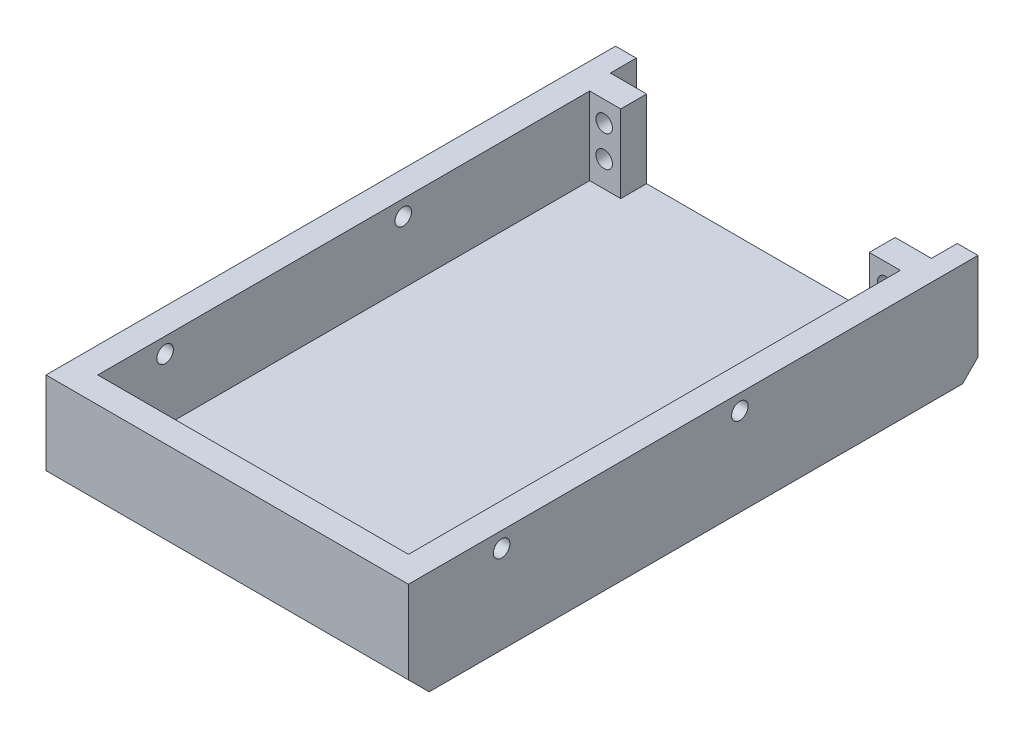
ISO-10303-21;
HEADER;
FILE_DESCRIPTION(('STEP AP214'),'2;1');
FILE_NAME('part.step','',(''),(''),'','','');
FILE_SCHEMA(('AUTOMOTIVE_DESIGN { 1 0 10303 214 1 1 1 1 }'));
ENDSEC;
DATA;
#1=APPLICATION_CONTEXT('core data for automotive mechanical design processes');
#2=APPLICATION_PROTOCOL_DEFINITION('international standard','automotive_design',2000,#1);
#3=PRODUCT_CONTEXT('',#1,'mechanical');
#4=PRODUCT('Part','Part','',(#3));
#5=PRODUCT_RELATED_PRODUCT_CATEGORY('part','',(#4));
#6=PRODUCT_DEFINITION_FORMATION('','',#4);
#7=PRODUCT_DEFINITION_CONTEXT('part definition',#1,'design');
#8=PRODUCT_DEFINITION('design','',#6,#7);
#9=PRODUCT_DEFINITION_SHAPE('','',#8);
#10=(LENGTH_UNIT() NAMED_UNIT(*) SI_UNIT(.MILLI.,.METRE.));
#11=(NAMED_UNIT(*) PLANE_ANGLE_UNIT() SI_UNIT($,.RADIAN.));
#12=(NAMED_UNIT(*) SI_UNIT($,.STERADIAN.) SOLID_ANGLE_UNIT());
#13=UNCERTAINTY_MEASURE_WITH_UNIT(LENGTH_MEASURE(1.E-05),#10,'distance_accuracy_value','');
#14=(GEOMETRIC_REPRESENTATION_CONTEXT(3) GLOBAL_UNCERTAINTY_ASSIGNED_CONTEXT((#13)) GLOBAL_UNIT_ASSIGNED_CONTEXT((#10,
#11,#12)) REPRESENTATION_CONTEXT('',''));
#15=CARTESIAN_POINT('',(0.,0.,0.));
#16=DIRECTION('',(0.,0.,1.));
#17=DIRECTION('',(1.,0.,0.));
#18=AXIS2_PLACEMENT_3D('',#15,#16,#17);
#19=CARTESIAN_POINT('',(-30.,20.,52.5));
#20=DIRECTION('',(1.,0.,0.));
#21=DIRECTION('',(0.,0.,-1.));
#22=AXIS2_PLACEMENT_3D('',#19,#20,#21);
#23=PLANE('',#22);
#24=CARTESIAN_POINT('',(-30.,17.,34.5));
#25=DIRECTION('',(1.,0.,0.));
#26=DIRECTION('',(0.,0.,-1.));
#27=AXIS2_PLACEMENT_3D('',#24,#25,#26);
#28=CIRCLE('',#27,1.6);
#29=CARTESIAN_POINT('',(-30.,17.,32.9));
#30=VERTEX_POINT('',#29);
#31=EDGE_CURVE('E295',#30,#30,#28,.T.);
#32=ORIENTED_EDGE('',*,*,#31,.F.);
#33=EDGE_LOOP('',(#32));
#34=FACE_BOUND('',#33,.T.);
#35=CARTESIAN_POINT('',(-30.,17.,-11.5));
#36=DIRECTION('',(1.,0.,0.));
#37=DIRECTION('',(0.,0.,-1.));
#38=AXIS2_PLACEMENT_3D('',#35,#36,#37);
#39=CIRCLE('',#38,1.6);
#40=CARTESIAN_POINT('',(-30.,17.,-13.1));
#41=VERTEX_POINT('',#40);
#42=EDGE_CURVE('E283',#41,#41,#39,.T.);
#43=ORIENTED_EDGE('',*,*,#42,.F.);
#44=EDGE_LOOP('',(#43));
#45=FACE_BOUND('',#44,.T.);
#46=DIRECTION('',(0.,0.,1.));
#47=VECTOR('',#46,1.);
#48=CARTESIAN_POINT('',(-30.,5.,0.));
#49=LINE('',#48,#47);
#50=CARTESIAN_POINT('',(-30.,5.,-47.5));
#51=VERTEX_POINT('',#50);
#52=CARTESIAN_POINT('',(-30.,5.,47.5));
#53=VERTEX_POINT('',#52);
#54=EDGE_CURVE('E302',#51,#53,#49,.T.);
#55=ORIENTED_EDGE('',*,*,#54,.F.);
#56=DIRECTION('',(0.,-1.,0.));
#57=VECTOR('',#56,1.);
#58=CARTESIAN_POINT('',(-30.,20.,-47.5));
#59=LINE('',#58,#57);
#60=CARTESIAN_POINT('',(-30.,20.,-47.5));
#61=VERTEX_POINT('',#60);
#62=EDGE_CURVE('E259',#61,#51,#59,.T.);
#63=ORIENTED_EDGE('',*,*,#62,.F.);
#64=DIRECTION('',(0.,0.,1.));
#65=VECTOR('',#64,1.);
#66=CARTESIAN_POINT('',(-30.,20.,0.));
#67=LINE('',#66,#65);
#68=CARTESIAN_POINT('',(-30.,20.,47.5));
#69=VERTEX_POINT('',#68);
#70=EDGE_CURVE('E316',#61,#69,#67,.T.);
#71=ORIENTED_EDGE('',*,*,#70,.T.);
#72=DIRECTION('',(0.,-1.,0.));
#73=VECTOR('',#72,1.);
#74=CARTESIAN_POINT('',(-30.,20.,47.5));
#75=LINE('',#74,#73);
#76=EDGE_CURVE('E306',#69,#53,#75,.T.);
#77=ORIENTED_EDGE('',*,*,#76,.T.);
#78=EDGE_LOOP('',(#55,#63,#71,#77));
#79=FACE_BOUND('',#78,.T.);
#80=ADVANCED_FACE('F41',(#34,#45,#79),#23,.T.);
#81=CARTESIAN_POINT('',(0.,5.,0.));
#82=DIRECTION('',(0.,-1.,0.));
#83=DIRECTION('',(0.,0.,-1.));
#84=AXIS2_PLACEMENT_3D('',#81,#82,#83);
#85=PLANE('',#84);
#86=DIRECTION('',(0.,0.,-1.));
#87=VECTOR('',#86,1.);
#88=CARTESIAN_POINT('',(30.,5.,0.));
#89=LINE('',#88,#87);
#90=CARTESIAN_POINT('',(30.,5.,47.5));
#91=VERTEX_POINT('',#90);
#92=CARTESIAN_POINT('',(30.,5.,-47.5));
#93=VERTEX_POINT('',#92);
#94=EDGE_CURVE('E299',#91,#93,#89,.T.);
#95=ORIENTED_EDGE('',*,*,#94,.T.);
#96=DIRECTION('',(1.,0.,0.));
#97=VECTOR('',#96,1.);
#98=CARTESIAN_POINT('',(24.,5.,-47.5));
#99=LINE('',#98,#97);
#100=CARTESIAN_POINT('',(24.,5.,-47.5));
#101=VERTEX_POINT('',#100);
#102=EDGE_CURVE('E252',#101,#93,#99,.T.);
#103=ORIENTED_EDGE('',*,*,#102,.F.);
#104=DIRECTION('',(0.,0.,-1.));
#105=VECTOR('',#104,1.);
#106=CARTESIAN_POINT('',(24.,5.,-47.5));
#107=LINE('',#106,#105);
#108=CARTESIAN_POINT('',(24.,5.,-52.5));
#109=VERTEX_POINT('',#108);
#110=EDGE_CURVE('E250',#101,#109,#107,.T.);
#111=ORIENTED_EDGE('',*,*,#110,.T.);
#112=DIRECTION('',(-1.,0.,0.));
#113=VECTOR('',#112,1.);
#114=CARTESIAN_POINT('',(30.,5.,-52.5));
#115=LINE('',#114,#113);
#116=CARTESIAN_POINT('',(-24.,5.,-52.5));
#117=VERTEX_POINT('',#116);
#118=EDGE_CURVE('E277',#109,#117,#115,.T.);
#119=ORIENTED_EDGE('',*,*,#118,.T.);
#120=DIRECTION('',(0.,0.,-1.));
#121=VECTOR('',#120,1.);
#122=CARTESIAN_POINT('',(-24.,5.,-47.5));
#123=LINE('',#122,#121);
#124=CARTESIAN_POINT('',(-24.,5.,-47.5));
#125=VERTEX_POINT('',#124);
#126=EDGE_CURVE('E263',#125,#117,#123,.T.);
#127=ORIENTED_EDGE('',*,*,#126,.F.);
#128=DIRECTION('',(-1.,0.,0.));
#129=VECTOR('',#128,1.);
#130=CARTESIAN_POINT('',(-24.,5.,-47.5));
#131=LINE('',#130,#129);
#132=EDGE_CURVE('E274',#125,#51,#131,.T.);
#133=ORIENTED_EDGE('',*,*,#132,.T.);
#134=ORIENTED_EDGE('',*,*,#54,.T.);
#135=DIRECTION('',(1.,0.,0.));
#136=VECTOR('',#135,1.);
#137=CARTESIAN_POINT('',(0.,5.,47.5));
#138=LINE('',#137,#136);
#139=EDGE_CURVE('E309',#53,#91,#138,.T.);
#140=ORIENTED_EDGE('',*,*,#139,.T.);
#141=EDGE_LOOP('',(#95,#103,#111,#119,#127,#133,#134,#140));
#142=FACE_BOUND('',#141,.T.);
#143=ADVANCED_FACE('F384',(#142),#85,.F.);
#144=CARTESIAN_POINT('',(0.,20.,0.));
#145=DIRECTION('',(0.,-1.,0.));
#146=DIRECTION('',(0.,0.,-1.));
#147=AXIS2_PLACEMENT_3D('',#144,#145,#146);
#148=PLANE('',#147);
#149=DIRECTION('',(0.,0.,-1.));
#150=VECTOR('',#149,1.);
#151=CARTESIAN_POINT('',(35.,20.,52.5));
#152=LINE('',#151,#150);
#153=CARTESIAN_POINT('',(35.,20.,52.5));
#154=VERTEX_POINT('',#153);
#155=CARTESIAN_POINT('',(35.,20.,-57.5));
#156=VERTEX_POINT('',#155);
#157=EDGE_CURVE('E319',#154,#156,#152,.T.);
#158=ORIENTED_EDGE('',*,*,#157,.T.);
#159=DIRECTION('',(1.,0.,0.));
#160=VECTOR('',#159,1.);
#161=CARTESIAN_POINT('',(35.,20.,-57.5));
#162=LINE('',#161,#160);
#163=CARTESIAN_POINT('',(31.,20.,-57.5));
#164=VERTEX_POINT('',#163);
#165=EDGE_CURVE('E205',#164,#156,#162,.T.);
#166=ORIENTED_EDGE('',*,*,#165,.F.);
#167=DIRECTION('',(0.,0.,-1.));
#168=VECTOR('',#167,1.);
#169=CARTESIAN_POINT('',(31.,20.,-57.5));
#170=LINE('',#169,#168);
#171=CARTESIAN_POINT('',(31.,20.,-52.5));
#172=VERTEX_POINT('',#171);
#173=EDGE_CURVE('E202',#172,#164,#170,.T.);
#174=ORIENTED_EDGE('',*,*,#173,.F.);
#175=DIRECTION('',(-1.,0.,0.));
#176=VECTOR('',#175,1.);
#177=CARTESIAN_POINT('',(-35.,20.,-52.5));
#178=LINE('',#177,#176);
#179=CARTESIAN_POINT('',(24.,20.,-52.5));
#180=VERTEX_POINT('',#179);
#181=EDGE_CURVE('E322',#172,#180,#178,.T.);
#182=ORIENTED_EDGE('',*,*,#181,.T.);
#183=DIRECTION('',(0.,0.,1.));
#184=VECTOR('',#183,1.);
#185=CARTESIAN_POINT('',(24.,20.,-47.5));
#186=LINE('',#185,#184);
#187=CARTESIAN_POINT('',(24.,20.,-47.5));
#188=VERTEX_POINT('',#187);
#189=EDGE_CURVE('E244',#180,#188,#186,.T.);
#190=ORIENTED_EDGE('',*,*,#189,.T.);
#191=DIRECTION('',(1.,0.,0.));
#192=VECTOR('',#191,1.);
#193=CARTESIAN_POINT('',(24.,20.,-47.5));
#194=LINE('',#193,#192);
#195=CARTESIAN_POINT('',(30.,20.,-47.5));
#196=VERTEX_POINT('',#195);
#197=EDGE_CURVE('E256',#188,#196,#194,.T.);
#198=ORIENTED_EDGE('',*,*,#197,.T.);
#199=DIRECTION('',(0.,0.,-1.));
#200=VECTOR('',#199,1.);
#201=CARTESIAN_POINT('',(30.,20.,0.));
#202=LINE('',#201,#200);
#203=CARTESIAN_POINT('',(30.,20.,47.5));
#204=VERTEX_POINT('',#203);
#205=EDGE_CURVE('E314',#204,#196,#202,.T.);
#206=ORIENTED_EDGE('',*,*,#205,.F.);
#207=DIRECTION('',(1.,0.,0.));
#208=VECTOR('',#207,1.);
#209=CARTESIAN_POINT('',(0.,20.,47.5));
#210=LINE('',#209,#208);
#211=EDGE_CURVE('E307',#69,#204,#210,.T.);
#212=ORIENTED_EDGE('',*,*,#211,.F.);
#213=ORIENTED_EDGE('',*,*,#70,.F.);
#214=DIRECTION('',(-1.,0.,0.));
#215=VECTOR('',#214,1.);
#216=CARTESIAN_POINT('',(-24.,20.,-47.5));
#217=LINE('',#216,#215);
#218=CARTESIAN_POINT('',(-24.,20.,-47.5));
#219=VERTEX_POINT('',#218);
#220=EDGE_CURVE('E271',#219,#61,#217,.T.);
#221=ORIENTED_EDGE('',*,*,#220,.F.);
#222=DIRECTION('',(0.,0.,1.));
#223=VECTOR('',#222,1.);
#224=CARTESIAN_POINT('',(-24.,20.,-47.5));
#225=LINE('',#224,#223);
#226=CARTESIAN_POINT('',(-24.,20.,-52.5));
#227=VERTEX_POINT('',#226);
#228=EDGE_CURVE('E269',#227,#219,#225,.T.);
#229=ORIENTED_EDGE('',*,*,#228,.F.);
#230=CARTESIAN_POINT('',(-31.,20.,-52.5));
#231=VERTEX_POINT('',#230);
#232=EDGE_CURVE('E180',#227,#231,#178,.T.);
#233=ORIENTED_EDGE('',*,*,#232,.T.);
#234=DIRECTION('',(0.,0.,-1.));
#235=VECTOR('',#234,1.);
#236=CARTESIAN_POINT('',(-31.,20.,-57.5));
#237=LINE('',#236,#235);
#238=CARTESIAN_POINT('',(-31.,20.,-57.5));
#239=VERTEX_POINT('',#238);
#240=EDGE_CURVE('E173',#231,#239,#237,.T.);
#241=ORIENTED_EDGE('',*,*,#240,.T.);
#242=DIRECTION('',(-1.,0.,0.));
#243=VECTOR('',#242,1.);
#244=CARTESIAN_POINT('',(-35.,20.,-57.5));
#245=LINE('',#244,#243);
#246=CARTESIAN_POINT('',(-35.,20.,-57.5));
#247=VERTEX_POINT('',#246);
#248=EDGE_CURVE('E177',#239,#247,#245,.T.);
#249=ORIENTED_EDGE('',*,*,#248,.T.);
#250=DIRECTION('',(0.,0.,1.));
#251=VECTOR('',#250,1.);
#252=CARTESIAN_POINT('',(-35.,20.,52.5));
#253=LINE('',#252,#251);
#254=CARTESIAN_POINT('',(-35.,20.,52.5));
#255=VERTEX_POINT('',#254);
#256=EDGE_CURVE('E324',#247,#255,#253,.T.);
#257=ORIENTED_EDGE('',*,*,#256,.T.);
#258=DIRECTION('',(1.,0.,0.));
#259=VECTOR('',#258,1.);
#260=CARTESIAN_POINT('',(-35.,20.,52.5));
#261=LINE('',#260,#259);
#262=EDGE_CURVE('E326',#255,#154,#261,.T.);
#263=ORIENTED_EDGE('',*,*,#262,.T.);
#264=EDGE_LOOP('',(#158,#166,#174,#182,#190,#198,#206,#212,#213,#221,#229,#233,#241,#249,#257,#263));
#265=FACE_BOUND('',#264,.T.);
#266=ADVANCED_FACE('F175',(#265),#148,.F.);
#267=CARTESIAN_POINT('',(35.,20.,52.5));
#268=DIRECTION('',(-1.,0.,0.));
#269=DIRECTION('',(0.,0.,1.));
#270=AXIS2_PLACEMENT_3D('',#267,#268,#269);
#271=PLANE('',#270);
#272=CARTESIAN_POINT('',(35.,17.,34.5));
#273=DIRECTION('',(-1.,0.,0.));
#274=DIRECTION('',(0.,0.,1.));
#275=AXIS2_PLACEMENT_3D('',#272,#273,#274);
#276=CIRCLE('',#275,1.6);
#277=CARTESIAN_POINT('',(35.,17.,36.1));
#278=VERTEX_POINT('',#277);
#279=EDGE_CURVE('E280',#278,#278,#276,.T.);
#280=ORIENTED_EDGE('',*,*,#279,.T.);
#281=EDGE_LOOP('',(#280));
#282=FACE_BOUND('',#281,.T.);
#283=CARTESIAN_POINT('',(35.,17.,-11.5));
#284=DIRECTION('',(-1.,0.,0.));
#285=DIRECTION('',(0.,0.,1.));
#286=AXIS2_PLACEMENT_3D('',#283,#284,#285);
#287=CIRCLE('',#286,1.6);
#288=CARTESIAN_POINT('',(35.,17.,-9.9));
#289=VERTEX_POINT('',#288);
#290=EDGE_CURVE('E287',#289,#289,#287,.T.);
#291=ORIENTED_EDGE('',*,*,#290,.T.);
#292=EDGE_LOOP('',(#291));
#293=FACE_BOUND('',#292,.T.);
#294=DIRECTION('',(0.,-1.,0.));
#295=VECTOR('',#294,1.);
#296=CARTESIAN_POINT('',(35.,20.,52.5));
#297=LINE('',#296,#295);
#298=CARTESIAN_POINT('',(35.,3.99999999999999,52.5));
#299=VERTEX_POINT('',#298);
#300=EDGE_CURVE('E328',#154,#299,#297,.T.);
#301=ORIENTED_EDGE('',*,*,#300,.T.);
#302=DIRECTION('',(0.,-0.707106781186545,-0.70710678118655));
#303=VECTOR('',#302,1.);
#304=CARTESIAN_POINT('',(35.,3.99999999999999,52.5));
#305=LINE('',#304,#303);
#306=CARTESIAN_POINT('',(35.,0.,48.5));
#307=VERTEX_POINT('',#306);
#308=EDGE_CURVE('E64',#299,#307,#305,.T.);
#309=ORIENTED_EDGE('',*,*,#308,.T.);
#310=DIRECTION('',(0.,0.,-1.));
#311=VECTOR('',#310,1.);
#312=CARTESIAN_POINT('',(35.,0.,52.5));
#313=LINE('',#312,#311);
#314=CARTESIAN_POINT('',(35.,0.,-54.5));
#315=VERTEX_POINT('',#314);
#316=EDGE_CURVE('E312',#307,#315,#313,.T.);
#317=ORIENTED_EDGE('',*,*,#316,.T.);
#318=DIRECTION('',(0.,0.707106781186546,-0.707106781186549));
#319=VECTOR('',#318,1.);
#320=CARTESIAN_POINT('',(35.,2.99999999999998,-57.5));
#321=LINE('',#320,#319);
#322=CARTESIAN_POINT('',(35.,2.99999999999998,-57.5));
#323=VERTEX_POINT('',#322);
#324=EDGE_CURVE('E350',#315,#323,#321,.T.);
#325=ORIENTED_EDGE('',*,*,#324,.T.);
#326=DIRECTION('',(0.,-1.,0.));
#327=VECTOR('',#326,1.);
#328=CARTESIAN_POINT('',(35.,26.4031242374329,-57.5));
#329=LINE('',#328,#327);
#330=EDGE_CURVE('E206',#156,#323,#329,.T.);
#331=ORIENTED_EDGE('',*,*,#330,.F.);
#332=ORIENTED_EDGE('',*,*,#157,.F.);
#333=EDGE_LOOP('',(#301,#309,#317,#325,#331,#332));
#334=FACE_BOUND('',#333,.T.);
#335=ADVANCED_FACE('F372',(#282,#293,#334),#271,.F.);
#336=CARTESIAN_POINT('',(-35.,20.,-52.5));
#337=DIRECTION('',(0.,0.,1.));
#338=DIRECTION('',(1.,0.,0.));
#339=AXIS2_PLACEMENT_3D('',#336,#337,#338);
#340=PLANE('',#339);
#341=CARTESIAN_POINT('',(-27.2,16.,-52.5));
#342=DIRECTION('',(0.,0.,1.));
#343=DIRECTION('',(1.,0.,0.));
#344=AXIS2_PLACEMENT_3D('',#341,#342,#343);
#345=CIRCLE('',#344,1.6);
#346=CARTESIAN_POINT('',(-25.6,16.,-52.5));
#347=VERTEX_POINT('',#346);
#348=EDGE_CURVE('E221',#347,#347,#345,.T.);
#349=ORIENTED_EDGE('',*,*,#348,.T.);
#350=EDGE_LOOP('',(#349));
#351=FACE_BOUND('',#350,.T.);
#352=CARTESIAN_POINT('',(-27.2,10.,-52.5));
#353=DIRECTION('',(0.,0.,1.));
#354=DIRECTION('',(1.,0.,0.));
#355=AXIS2_PLACEMENT_3D('',#352,#353,#354);
#356=CIRCLE('',#355,1.6);
#357=CARTESIAN_POINT('',(-25.6,10.,-52.5));
#358=VERTEX_POINT('',#357);
#359=EDGE_CURVE('E208',#358,#358,#356,.T.);
#360=ORIENTED_EDGE('',*,*,#359,.T.);
#361=EDGE_LOOP('',(#360));
#362=FACE_BOUND('',#361,.T.);
#363=CARTESIAN_POINT('',(27.2,16.,-52.5));
#364=DIRECTION('',(0.,0.,-1.));
#365=DIRECTION('',(-1.,0.,0.));
#366=AXIS2_PLACEMENT_3D('',#363,#364,#365);
#367=CIRCLE('',#366,1.6);
#368=CARTESIAN_POINT('',(25.6,16.,-52.5));
#369=VERTEX_POINT('',#368);
#370=EDGE_CURVE('E229',#369,#369,#367,.T.);
#371=ORIENTED_EDGE('',*,*,#370,.F.);
#372=EDGE_LOOP('',(#371));
#373=FACE_BOUND('',#372,.T.);
#374=CARTESIAN_POINT('',(27.2,10.,-52.5));
#375=DIRECTION('',(0.,0.,-1.));
#376=DIRECTION('',(-1.,0.,0.));
#377=AXIS2_PLACEMENT_3D('',#374,#375,#376);
#378=CIRCLE('',#377,1.6);
#379=CARTESIAN_POINT('',(25.6,10.,-52.5));
#380=VERTEX_POINT('',#379);
#381=EDGE_CURVE('E236',#380,#380,#378,.T.);
#382=ORIENTED_EDGE('',*,*,#381,.F.);
#383=EDGE_LOOP('',(#382));
#384=FACE_BOUND('',#383,.T.);
#385=DIRECTION('',(-1.,0.,0.));
#386=VECTOR('',#385,1.);
#387=CARTESIAN_POINT('',(-35.,0.,-52.5));
#388=LINE('',#387,#386);
#389=CARTESIAN_POINT('',(31.,0.,-52.5));
#390=VERTEX_POINT('',#389);
#391=CARTESIAN_POINT('',(-31.,0.,-52.5));
#392=VERTEX_POINT('',#391);
#393=EDGE_CURVE('E330',#390,#392,#388,.T.);
#394=ORIENTED_EDGE('',*,*,#393,.T.);
#395=DIRECTION('',(0.,-1.,0.));
#396=VECTOR('',#395,1.);
#397=CARTESIAN_POINT('',(-31.,26.4031242374329,-52.5));
#398=LINE('',#397,#396);
#399=EDGE_CURVE('E183',#231,#392,#398,.T.);
#400=ORIENTED_EDGE('',*,*,#399,.F.);
#401=ORIENTED_EDGE('',*,*,#232,.F.);
#402=DIRECTION('',(0.,1.,0.));
#403=VECTOR('',#402,1.);
#404=CARTESIAN_POINT('',(-24.,20.,-52.5));
#405=LINE('',#404,#403);
#406=EDGE_CURVE('E266',#117,#227,#405,.T.);
#407=ORIENTED_EDGE('',*,*,#406,.F.);
#408=ORIENTED_EDGE('',*,*,#118,.F.);
#409=DIRECTION('',(0.,1.,0.));
#410=VECTOR('',#409,1.);
#411=CARTESIAN_POINT('',(24.,20.,-52.5));
#412=LINE('',#411,#410);
#413=EDGE_CURVE('E247',#109,#180,#412,.T.);
#414=ORIENTED_EDGE('',*,*,#413,.T.);
#415=ORIENTED_EDGE('',*,*,#181,.F.);
#416=DIRECTION('',(0.,-1.,0.));
#417=VECTOR('',#416,1.);
#418=CARTESIAN_POINT('',(31.,26.4031242374329,-52.5));
#419=LINE('',#418,#417);
#420=EDGE_CURVE('E198',#172,#390,#419,.T.);
#421=ORIENTED_EDGE('',*,*,#420,.T.);
#422=EDGE_LOOP('',(#394,#400,#401,#407,#408,#414,#415,#421));
#423=FACE_BOUND('',#422,.T.);
#424=ADVANCED_FACE('F412',(#351,#362,#373,#384,#423),#340,.F.);
#425=CARTESIAN_POINT('',(-35.,20.,52.5));
#426=DIRECTION('',(1.,0.,0.));
#427=DIRECTION('',(0.,0.,-1.));
#428=AXIS2_PLACEMENT_3D('',#425,#426,#427);
#429=PLANE('',#428);
#430=CARTESIAN_POINT('',(-35.,17.,34.5));
#431=DIRECTION('',(-1.,0.,0.));
#432=DIRECTION('',(0.,0.,1.));
#433=AXIS2_PLACEMENT_3D('',#430,#431,#432);
#434=CIRCLE('',#433,1.6);
#435=CARTESIAN_POINT('',(-35.,17.,36.1));
#436=VERTEX_POINT('',#435);
#437=EDGE_CURVE('E284',#436,#436,#434,.T.);
#438=ORIENTED_EDGE('',*,*,#437,.F.);
#439=EDGE_LOOP('',(#438));
#440=FACE_BOUND('',#439,.T.);
#441=CARTESIAN_POINT('',(-35.,17.,-11.5));
#442=DIRECTION('',(-1.,0.,0.));
#443=DIRECTION('',(0.,0.,1.));
#444=AXIS2_PLACEMENT_3D('',#441,#442,#443);
#445=CIRCLE('',#444,1.6);
#446=CARTESIAN_POINT('',(-35.,17.,-9.9));
#447=VERTEX_POINT('',#446);
#448=EDGE_CURVE('E279',#447,#447,#445,.T.);
#449=ORIENTED_EDGE('',*,*,#448,.F.);
#450=EDGE_LOOP('',(#449));
#451=FACE_BOUND('',#450,.T.);
#452=DIRECTION('',(0.,0.,1.));
#453=VECTOR('',#452,1.);
#454=CARTESIAN_POINT('',(-35.,0.,52.5));
#455=LINE('',#454,#453);
#456=CARTESIAN_POINT('',(-35.,0.,-54.5));
#457=VERTEX_POINT('',#456);
#458=CARTESIAN_POINT('',(-35.,0.,48.5));
#459=VERTEX_POINT('',#458);
#460=EDGE_CURVE('E321',#457,#459,#455,.T.);
#461=ORIENTED_EDGE('',*,*,#460,.T.);
#462=DIRECTION('',(0.,0.707106781186545,0.70710678118655));
#463=VECTOR('',#462,1.);
#464=CARTESIAN_POINT('',(-35.,3.99999999999999,52.5));
#465=LINE('',#464,#463);
#466=CARTESIAN_POINT('',(-35.,3.99999999999999,52.5));
#467=VERTEX_POINT('',#466);
#468=EDGE_CURVE('E11',#459,#467,#465,.T.);
#469=ORIENTED_EDGE('',*,*,#468,.T.);
#470=DIRECTION('',(0.,-1.,0.));
#471=VECTOR('',#470,1.);
#472=CARTESIAN_POINT('',(-35.,20.,52.5));
#473=LINE('',#472,#471);
#474=EDGE_CURVE('E335',#255,#467,#473,.T.);
#475=ORIENTED_EDGE('',*,*,#474,.F.);
#476=ORIENTED_EDGE('',*,*,#256,.F.);
#477=DIRECTION('',(0.,-1.,0.));
#478=VECTOR('',#477,1.);
#479=CARTESIAN_POINT('',(-35.,26.4031242374329,-57.5));
#480=LINE('',#479,#478);
#481=CARTESIAN_POINT('',(-35.,2.99999999999998,-57.5));
#482=VERTEX_POINT('',#481);
#483=EDGE_CURVE('E192',#247,#482,#480,.T.);
#484=ORIENTED_EDGE('',*,*,#483,.T.);
#485=DIRECTION('',(0.,0.707106781186546,-0.707106781186549));
#486=VECTOR('',#485,1.);
#487=CARTESIAN_POINT('',(-35.,0.,-54.5));
#488=LINE('',#487,#486);
#489=EDGE_CURVE('E358',#482,#457,#488,.F.);
#490=ORIENTED_EDGE('',*,*,#489,.T.);
#491=EDGE_LOOP('',(#461,#469,#475,#476,#484,#490));
#492=FACE_BOUND('',#491,.T.);
#493=ADVANCED_FACE('F376',(#440,#451,#492),#429,.F.);
#494=CARTESIAN_POINT('',(-35.,20.,52.5));
#495=DIRECTION('',(0.,0.,-1.));
#496=DIRECTION('',(-1.,0.,0.));
#497=AXIS2_PLACEMENT_3D('',#494,#495,#496);
#498=PLANE('',#497);
#499=ORIENTED_EDGE('',*,*,#474,.T.);
#500=DIRECTION('',(1.,0.,0.));
#501=VECTOR('',#500,1.);
#502=CARTESIAN_POINT('',(35.,3.99999999999999,52.5));
#503=LINE('',#502,#501);
#504=EDGE_CURVE('E360',#467,#299,#503,.T.);
#505=ORIENTED_EDGE('',*,*,#504,.T.);
#506=ORIENTED_EDGE('',*,*,#300,.F.);
#507=ORIENTED_EDGE('',*,*,#262,.F.);
#508=EDGE_LOOP('',(#499,#505,#506,#507));
#509=FACE_BOUND('',#508,.T.);
#510=ADVANCED_FACE('F366',(#509),#498,.F.);
#511=CARTESIAN_POINT('',(0.,0.,0.));
#512=DIRECTION('',(0.,-1.,0.));
#513=DIRECTION('',(0.,0.,-1.));
#514=AXIS2_PLACEMENT_3D('',#511,#512,#513);
#515=PLANE('',#514);
#516=ORIENTED_EDGE('',*,*,#316,.F.);
#517=DIRECTION('',(-1.,0.,0.));
#518=VECTOR('',#517,1.);
#519=CARTESIAN_POINT('',(-35.,0.,48.5));
#520=LINE('',#519,#518);
#521=EDGE_CURVE('E50',#307,#459,#520,.T.);
#522=ORIENTED_EDGE('',*,*,#521,.T.);
#523=ORIENTED_EDGE('',*,*,#460,.F.);
#524=DIRECTION('',(1.,0.,0.));
#525=VECTOR('',#524,1.);
#526=CARTESIAN_POINT('',(0.,0.,-54.5));
#527=LINE('',#526,#525);
#528=CARTESIAN_POINT('',(-31.,0.,-54.5));
#529=VERTEX_POINT('',#528);
#530=EDGE_CURVE('E352',#457,#529,#527,.T.);
#531=ORIENTED_EDGE('',*,*,#530,.T.);
#532=DIRECTION('',(0.,0.,1.));
#533=VECTOR('',#532,1.);
#534=CARTESIAN_POINT('',(-31.,0.,-57.5));
#535=LINE('',#534,#533);
#536=EDGE_CURVE('E759',#529,#392,#535,.T.);
#537=ORIENTED_EDGE('',*,*,#536,.T.);
#538=ORIENTED_EDGE('',*,*,#393,.F.);
#539=DIRECTION('',(0.,0.,1.));
#540=VECTOR('',#539,1.);
#541=CARTESIAN_POINT('',(31.,0.,-57.5));
#542=LINE('',#541,#540);
#543=CARTESIAN_POINT('',(31.,0.,-54.5));
#544=VERTEX_POINT('',#543);
#545=EDGE_CURVE('E196',#544,#390,#542,.T.);
#546=ORIENTED_EDGE('',*,*,#545,.F.);
#547=DIRECTION('',(1.,0.,0.));
#548=VECTOR('',#547,1.);
#549=CARTESIAN_POINT('',(35.,0.,-54.5));
#550=LINE('',#549,#548);
#551=EDGE_CURVE('E347',#544,#315,#550,.T.);
#552=ORIENTED_EDGE('',*,*,#551,.T.);
#553=EDGE_LOOP('',(#516,#522,#523,#531,#537,#538,#546,#552));
#554=FACE_BOUND('',#553,.T.);
#555=ADVANCED_FACE('F405',(#554),#515,.T.);
#556=CARTESIAN_POINT('',(30.,20.,52.5));
#557=DIRECTION('',(-1.,0.,0.));
#558=DIRECTION('',(0.,0.,1.));
#559=AXIS2_PLACEMENT_3D('',#556,#557,#558);
#560=PLANE('',#559);
#561=DIRECTION('',(0.,-1.,0.));
#562=VECTOR('',#561,1.);
#563=CARTESIAN_POINT('',(30.,20.,-47.5));
#564=LINE('',#563,#562);
#565=EDGE_CURVE('E232',#196,#93,#564,.T.);
#566=ORIENTED_EDGE('',*,*,#565,.T.);
#567=ORIENTED_EDGE('',*,*,#94,.F.);
#568=DIRECTION('',(0.,-1.,0.));
#569=VECTOR('',#568,1.);
#570=CARTESIAN_POINT('',(30.,20.,47.5));
#571=LINE('',#570,#569);
#572=EDGE_CURVE('E303',#204,#91,#571,.T.);
#573=ORIENTED_EDGE('',*,*,#572,.F.);
#574=ORIENTED_EDGE('',*,*,#205,.T.);
#575=EDGE_LOOP('',(#566,#567,#573,#574));
#576=FACE_BOUND('',#575,.T.);
#577=CARTESIAN_POINT('',(30.,17.,34.5));
#578=DIRECTION('',(-1.,0.,0.));
#579=DIRECTION('',(0.,0.,1.));
#580=AXIS2_PLACEMENT_3D('',#577,#578,#579);
#581=CIRCLE('',#580,1.6);
#582=CARTESIAN_POINT('',(30.,17.,36.1));
#583=VERTEX_POINT('',#582);
#584=EDGE_CURVE('E296',#583,#583,#581,.T.);
#585=ORIENTED_EDGE('',*,*,#584,.F.);
#586=EDGE_LOOP('',(#585));
#587=FACE_BOUND('',#586,.T.);
#588=CARTESIAN_POINT('',(30.,17.,-11.5));
#589=DIRECTION('',(-1.,0.,0.));
#590=DIRECTION('',(0.,0.,1.));
#591=AXIS2_PLACEMENT_3D('',#588,#589,#590);
#592=CIRCLE('',#591,1.6);
#593=CARTESIAN_POINT('',(30.,17.,-9.9));
#594=VERTEX_POINT('',#593);
#595=EDGE_CURVE('E292',#594,#594,#592,.T.);
#596=ORIENTED_EDGE('',*,*,#595,.F.);
#597=EDGE_LOOP('',(#596));
#598=FACE_BOUND('',#597,.T.);
#599=ADVANCED_FACE('F396',(#576,#587,#598),#560,.T.);
#600=CARTESIAN_POINT('',(-35.,20.,47.5));
#601=DIRECTION('',(0.,0.,-1.));
#602=DIRECTION('',(-1.,0.,0.));
#603=AXIS2_PLACEMENT_3D('',#600,#601,#602);
#604=PLANE('',#603);
#605=ORIENTED_EDGE('',*,*,#139,.F.);
#606=ORIENTED_EDGE('',*,*,#76,.F.);
#607=ORIENTED_EDGE('',*,*,#211,.T.);
#608=ORIENTED_EDGE('',*,*,#572,.T.);
#609=EDGE_LOOP('',(#605,#606,#607,#608));
#610=FACE_BOUND('',#609,.T.);
#611=ADVANCED_FACE('F398',(#610),#604,.T.);
#612=CARTESIAN_POINT('',(35.,17.,-11.5));
#613=DIRECTION('',(-1.,0.,0.));
#614=DIRECTION('',(0.,0.,1.));
#615=AXIS2_PLACEMENT_3D('',#612,#613,#614);
#616=CYLINDRICAL_SURFACE('',#615,1.6);
#617=ORIENTED_EDGE('',*,*,#42,.T.);
#618=EDGE_LOOP('',(#617));
#619=FACE_BOUND('',#618,.T.);
#620=ORIENTED_EDGE('',*,*,#448,.T.);
#621=EDGE_LOOP('',(#620));
#622=FACE_BOUND('',#621,.T.);
#623=ADVANCED_FACE('F400',(#619,#622),#616,.F.);
#624=CARTESIAN_POINT('',(35.,17.,34.5));
#625=DIRECTION('',(-1.,0.,0.));
#626=DIRECTION('',(0.,0.,1.));
#627=AXIS2_PLACEMENT_3D('',#624,#625,#626);
#628=CYLINDRICAL_SURFACE('',#627,1.6);
#629=ORIENTED_EDGE('',*,*,#31,.T.);
#630=EDGE_LOOP('',(#629));
#631=FACE_BOUND('',#630,.T.);
#632=ORIENTED_EDGE('',*,*,#437,.T.);
#633=EDGE_LOOP('',(#632));
#634=FACE_BOUND('',#633,.T.);
#635=ADVANCED_FACE('F486',(#631,#634),#628,.F.);
#636=ORIENTED_EDGE('',*,*,#595,.T.);
#637=EDGE_LOOP('',(#636));
#638=FACE_BOUND('',#637,.T.);
#639=ORIENTED_EDGE('',*,*,#290,.F.);
#640=EDGE_LOOP('',(#639));
#641=FACE_BOUND('',#640,.T.);
#642=ADVANCED_FACE('F482',(#638,#641),#616,.F.);
#643=ORIENTED_EDGE('',*,*,#584,.T.);
#644=EDGE_LOOP('',(#643));
#645=FACE_BOUND('',#644,.T.);
#646=ORIENTED_EDGE('',*,*,#279,.F.);
#647=EDGE_LOOP('',(#646));
#648=FACE_BOUND('',#647,.T.);
#649=ADVANCED_FACE('F485',(#645,#648),#628,.F.);
#650=CARTESIAN_POINT('',(-24.,20.,-47.5));
#651=DIRECTION('',(0.,0.,-1.));
#652=DIRECTION('',(-1.,0.,0.));
#653=AXIS2_PLACEMENT_3D('',#650,#651,#652);
#654=PLANE('',#653);
#655=CARTESIAN_POINT('',(-27.2,16.,-47.5));
#656=DIRECTION('',(0.,0.,-1.));
#657=DIRECTION('',(-1.,0.,0.));
#658=AXIS2_PLACEMENT_3D('',#655,#656,#657);
#659=CIRCLE('',#658,1.6);
#660=CARTESIAN_POINT('',(-28.8,16.,-47.5));
#661=VERTEX_POINT('',#660);
#662=EDGE_CURVE('E217',#661,#661,#659,.T.);
#663=ORIENTED_EDGE('',*,*,#662,.T.);
#664=EDGE_LOOP('',(#663));
#665=FACE_BOUND('',#664,.T.);
#666=CARTESIAN_POINT('',(-27.2,10.,-47.5));
#667=DIRECTION('',(0.,0.,-1.));
#668=DIRECTION('',(-1.,0.,0.));
#669=AXIS2_PLACEMENT_3D('',#666,#667,#668);
#670=CIRCLE('',#669,1.6);
#671=CARTESIAN_POINT('',(-28.8,10.,-47.5));
#672=VERTEX_POINT('',#671);
#673=EDGE_CURVE('E224',#672,#672,#670,.T.);
#674=ORIENTED_EDGE('',*,*,#673,.T.);
#675=EDGE_LOOP('',(#674));
#676=FACE_BOUND('',#675,.T.);
#677=ORIENTED_EDGE('',*,*,#62,.T.);
#678=ORIENTED_EDGE('',*,*,#132,.F.);
#679=DIRECTION('',(0.,-1.,0.));
#680=VECTOR('',#679,1.);
#681=CARTESIAN_POINT('',(-24.,20.,-47.5));
#682=LINE('',#681,#680);
#683=EDGE_CURVE('E260',#219,#125,#682,.T.);
#684=ORIENTED_EDGE('',*,*,#683,.F.);
#685=ORIENTED_EDGE('',*,*,#220,.T.);
#686=EDGE_LOOP('',(#677,#678,#684,#685));
#687=FACE_BOUND('',#686,.T.);
#688=ADVANCED_FACE('F461',(#665,#676,#687),#654,.F.);
#689=CARTESIAN_POINT('',(-24.,0.,0.));
#690=DIRECTION('',(1.,0.,0.));
#691=DIRECTION('',(0.,0.,-1.));
#692=AXIS2_PLACEMENT_3D('',#689,#690,#691);
#693=PLANE('',#692);
#694=ORIENTED_EDGE('',*,*,#683,.T.);
#695=ORIENTED_EDGE('',*,*,#126,.T.);
#696=ORIENTED_EDGE('',*,*,#406,.T.);
#697=ORIENTED_EDGE('',*,*,#228,.T.);
#698=EDGE_LOOP('',(#694,#695,#696,#697));
#699=FACE_BOUND('',#698,.T.);
#700=ADVANCED_FACE('F457',(#699),#693,.T.);
#701=CARTESIAN_POINT('',(24.,20.,-47.5));
#702=DIRECTION('',(0.,0.,1.));
#703=DIRECTION('',(1.,0.,0.));
#704=AXIS2_PLACEMENT_3D('',#701,#702,#703);
#705=PLANE('',#704);
#706=CARTESIAN_POINT('',(27.2,16.,-47.5));
#707=DIRECTION('',(0.,0.,1.));
#708=DIRECTION('',(1.,0.,0.));
#709=AXIS2_PLACEMENT_3D('',#706,#707,#708);
#710=CIRCLE('',#709,1.6);
#711=CARTESIAN_POINT('',(28.8,16.,-47.5));
#712=VERTEX_POINT('',#711);
#713=EDGE_CURVE('E233',#712,#712,#710,.F.);
#714=ORIENTED_EDGE('',*,*,#713,.T.);
#715=EDGE_LOOP('',(#714));
#716=FACE_BOUND('',#715,.T.);
#717=CARTESIAN_POINT('',(27.2,10.,-47.5));
#718=DIRECTION('',(0.,0.,1.));
#719=DIRECTION('',(1.,0.,0.));
#720=AXIS2_PLACEMENT_3D('',#717,#718,#719);
#721=CIRCLE('',#720,1.6);
#722=CARTESIAN_POINT('',(28.8,10.,-47.5));
#723=VERTEX_POINT('',#722);
#724=EDGE_CURVE('E220',#723,#723,#721,.F.);
#725=ORIENTED_EDGE('',*,*,#724,.T.);
#726=EDGE_LOOP('',(#725));
#727=FACE_BOUND('',#726,.T.);
#728=ORIENTED_EDGE('',*,*,#565,.F.);
#729=ORIENTED_EDGE('',*,*,#197,.F.);
#730=DIRECTION('',(0.,-1.,0.));
#731=VECTOR('',#730,1.);
#732=CARTESIAN_POINT('',(24.,20.,-47.5));
#733=LINE('',#732,#731);
#734=EDGE_CURVE('E241',#188,#101,#733,.T.);
#735=ORIENTED_EDGE('',*,*,#734,.T.);
#736=ORIENTED_EDGE('',*,*,#102,.T.);
#737=EDGE_LOOP('',(#728,#729,#735,#736));
#738=FACE_BOUND('',#737,.T.);
#739=ADVANCED_FACE('F474',(#716,#727,#738),#705,.T.);
#740=CARTESIAN_POINT('',(24.,0.,0.));
#741=DIRECTION('',(-1.,0.,0.));
#742=DIRECTION('',(0.,0.,-1.));
#743=AXIS2_PLACEMENT_3D('',#740,#741,#742);
#744=PLANE('',#743);
#745=ORIENTED_EDGE('',*,*,#734,.F.);
#746=ORIENTED_EDGE('',*,*,#189,.F.);
#747=ORIENTED_EDGE('',*,*,#413,.F.);
#748=ORIENTED_EDGE('',*,*,#110,.F.);
#749=EDGE_LOOP('',(#745,#746,#747,#748));
#750=FACE_BOUND('',#749,.T.);
#751=ADVANCED_FACE('F451',(#750),#744,.T.);
#752=CARTESIAN_POINT('',(27.2,10.,52.501));
#753=DIRECTION('',(0.,0.,-1.));
#754=DIRECTION('',(-1.,0.,0.));
#755=AXIS2_PLACEMENT_3D('',#752,#753,#754);
#756=CYLINDRICAL_SURFACE('',#755,1.6);
#757=ORIENTED_EDGE('',*,*,#724,.F.);
#758=EDGE_LOOP('',(#757));
#759=FACE_BOUND('',#758,.T.);
#760=ORIENTED_EDGE('',*,*,#381,.T.);
#761=EDGE_LOOP('',(#760));
#762=FACE_BOUND('',#761,.T.);
#763=ADVANCED_FACE('F563',(#759,#762),#756,.F.);
#764=CARTESIAN_POINT('',(27.2,16.,52.501));
#765=DIRECTION('',(0.,0.,-1.));
#766=DIRECTION('',(-1.,0.,0.));
#767=AXIS2_PLACEMENT_3D('',#764,#765,#766);
#768=CYLINDRICAL_SURFACE('',#767,1.6);
#769=ORIENTED_EDGE('',*,*,#713,.F.);
#770=EDGE_LOOP('',(#769));
#771=FACE_BOUND('',#770,.T.);
#772=ORIENTED_EDGE('',*,*,#370,.T.);
#773=EDGE_LOOP('',(#772));
#774=FACE_BOUND('',#773,.T.);
#775=ADVANCED_FACE('F581',(#771,#774),#768,.F.);
#776=CARTESIAN_POINT('',(-27.2,10.,52.501));
#777=DIRECTION('',(0.,0.,-1.));
#778=DIRECTION('',(-1.,0.,0.));
#779=AXIS2_PLACEMENT_3D('',#776,#777,#778);
#780=CYLINDRICAL_SURFACE('',#779,1.6);
#781=ORIENTED_EDGE('',*,*,#359,.F.);
#782=EDGE_LOOP('',(#781));
#783=FACE_BOUND('',#782,.T.);
#784=ORIENTED_EDGE('',*,*,#673,.F.);
#785=EDGE_LOOP('',(#784));
#786=FACE_BOUND('',#785,.T.);
#787=ADVANCED_FACE('F591',(#783,#786),#780,.F.);
#788=CARTESIAN_POINT('',(-27.2,16.,52.501));
#789=DIRECTION('',(0.,0.,-1.));
#790=DIRECTION('',(-1.,0.,0.));
#791=AXIS2_PLACEMENT_3D('',#788,#789,#790);
#792=CYLINDRICAL_SURFACE('',#791,1.6);
#793=ORIENTED_EDGE('',*,*,#348,.F.);
#794=EDGE_LOOP('',(#793));
#795=FACE_BOUND('',#794,.T.);
#796=ORIENTED_EDGE('',*,*,#662,.F.);
#797=EDGE_LOOP('',(#796));
#798=FACE_BOUND('',#797,.T.);
#799=ADVANCED_FACE('F609',(#795,#798),#792,.F.);
#800=CARTESIAN_POINT('',(31.,26.4031242374329,-57.5));
#801=DIRECTION('',(1.,0.,0.));
#802=DIRECTION('',(0.,0.,-1.));
#803=AXIS2_PLACEMENT_3D('',#800,#801,#802);
#804=PLANE('',#803);
#805=DIRECTION('',(0.,-1.,0.));
#806=VECTOR('',#805,1.);
#807=CARTESIAN_POINT('',(31.,26.4031242374329,-57.5));
#808=LINE('',#807,#806);
#809=CARTESIAN_POINT('',(31.,2.99999999999998,-57.5));
#810=VERTEX_POINT('',#809);
#811=EDGE_CURVE('E212',#164,#810,#808,.T.);
#812=ORIENTED_EDGE('',*,*,#811,.T.);
#813=DIRECTION('',(0.,-0.707106781186546,0.707106781186549));
#814=VECTOR('',#813,1.);
#815=CARTESIAN_POINT('',(31.,2.99999999999996,-57.5));
#816=LINE('',#815,#814);
#817=EDGE_CURVE('E345',#810,#544,#816,.T.);
#818=ORIENTED_EDGE('',*,*,#817,.T.);
#819=ORIENTED_EDGE('',*,*,#545,.T.);
#820=ORIENTED_EDGE('',*,*,#420,.F.);
#821=ORIENTED_EDGE('',*,*,#173,.T.);
#822=EDGE_LOOP('',(#812,#818,#819,#820,#821));
#823=FACE_BOUND('',#822,.T.);
#824=ADVANCED_FACE('F437',(#823),#804,.F.);
#825=CARTESIAN_POINT('',(35.,26.4031242374329,-57.5));
#826=DIRECTION('',(0.,0.,1.));
#827=DIRECTION('',(1.,0.,0.));
#828=AXIS2_PLACEMENT_3D('',#825,#826,#827);
#829=PLANE('',#828);
#830=ORIENTED_EDGE('',*,*,#330,.T.);
#831=DIRECTION('',(-1.,0.,0.));
#832=VECTOR('',#831,1.);
#833=CARTESIAN_POINT('',(31.,2.99999999999998,-57.5));
#834=LINE('',#833,#832);
#835=EDGE_CURVE('E338',#323,#810,#834,.T.);
#836=ORIENTED_EDGE('',*,*,#835,.T.);
#837=ORIENTED_EDGE('',*,*,#811,.F.);
#838=ORIENTED_EDGE('',*,*,#165,.T.);
#839=EDGE_LOOP('',(#830,#836,#837,#838));
#840=FACE_BOUND('',#839,.T.);
#841=ADVANCED_FACE('F426',(#840),#829,.F.);
#842=CARTESIAN_POINT('',(35.,2.99999999999998,-57.5));
#843=DIRECTION('',(0.,-0.707106781186549,-0.707106781186546));
#844=DIRECTION('',(1.,0.,0.));
#845=AXIS2_PLACEMENT_3D('',#842,#843,#844);
#846=PLANE('',#845);
#847=ORIENTED_EDGE('',*,*,#324,.F.);
#848=ORIENTED_EDGE('',*,*,#551,.F.);
#849=ORIENTED_EDGE('',*,*,#817,.F.);
#850=ORIENTED_EDGE('',*,*,#835,.F.);
#851=EDGE_LOOP('',(#847,#848,#849,#850));
#852=FACE_BOUND('',#851,.T.);
#853=ADVANCED_FACE('F421',(#852),#846,.T.);
#854=CARTESIAN_POINT('',(-31.,26.4031242374329,-57.5));
#855=DIRECTION('',(1.,0.,0.));
#856=DIRECTION('',(0.,0.,-1.));
#857=AXIS2_PLACEMENT_3D('',#854,#855,#856);
#858=PLANE('',#857);
#859=ORIENTED_EDGE('',*,*,#536,.F.);
#860=DIRECTION('',(0.,-0.707106781186546,0.707106781186549));
#861=VECTOR('',#860,1.);
#862=CARTESIAN_POINT('',(-30.9999999999999,14.7015621187164,-69.2015621187164));
#863=LINE('',#862,#861);
#864=CARTESIAN_POINT('',(-31.,2.99999999999998,-57.5));
#865=VERTEX_POINT('',#864);
#866=EDGE_CURVE('E189',#529,#865,#863,.F.);
#867=ORIENTED_EDGE('',*,*,#866,.T.);
#868=DIRECTION('',(0.,-1.,0.));
#869=VECTOR('',#868,1.);
#870=CARTESIAN_POINT('',(-31.,26.4031242374329,-57.5));
#871=LINE('',#870,#869);
#872=EDGE_CURVE('E186',#239,#865,#871,.T.);
#873=ORIENTED_EDGE('',*,*,#872,.F.);
#874=ORIENTED_EDGE('',*,*,#240,.F.);
#875=ORIENTED_EDGE('',*,*,#399,.T.);
#876=EDGE_LOOP('',(#859,#867,#873,#874,#875));
#877=FACE_BOUND('',#876,.T.);
#878=ADVANCED_FACE('F188',(#877),#858,.T.);
#879=CARTESIAN_POINT('',(-35.,26.4031242374329,-57.5));
#880=DIRECTION('',(0.,0.,-1.));
#881=DIRECTION('',(-1.,0.,0.));
#882=AXIS2_PLACEMENT_3D('',#879,#880,#881);
#883=PLANE('',#882);
#884=ORIENTED_EDGE('',*,*,#872,.T.);
#885=DIRECTION('',(-1.,0.,0.));
#886=VECTOR('',#885,1.);
#887=CARTESIAN_POINT('',(-35.,2.99999999999998,-57.5));
#888=LINE('',#887,#886);
#889=EDGE_CURVE('E356',#865,#482,#888,.T.);
#890=ORIENTED_EDGE('',*,*,#889,.T.);
#891=ORIENTED_EDGE('',*,*,#483,.F.);
#892=ORIENTED_EDGE('',*,*,#248,.F.);
#893=EDGE_LOOP('',(#884,#890,#891,#892));
#894=FACE_BOUND('',#893,.T.);
#895=ADVANCED_FACE('F194',(#894),#883,.T.);
#896=CARTESIAN_POINT('',(0.,0.,-54.5));
#897=DIRECTION('',(0.,0.707106781186549,0.707106781186546));
#898=DIRECTION('',(1.,0.,0.));
#899=AXIS2_PLACEMENT_3D('',#896,#897,#898);
#900=PLANE('',#899);
#901=ORIENTED_EDGE('',*,*,#489,.F.);
#902=ORIENTED_EDGE('',*,*,#889,.F.);
#903=ORIENTED_EDGE('',*,*,#866,.F.);
#904=ORIENTED_EDGE('',*,*,#530,.F.);
#905=EDGE_LOOP('',(#901,#902,#903,#904));
#906=FACE_BOUND('',#905,.T.);
#907=ADVANCED_FACE('F378',(#906),#900,.F.);
#908=CARTESIAN_POINT('',(-35.,3.99999999999999,52.5));
#909=DIRECTION('',(0.,-0.70710678118655,0.707106781186545));
#910=DIRECTION('',(-1.,0.,0.));
#911=AXIS2_PLACEMENT_3D('',#908,#909,#910);
#912=PLANE('',#911);
#913=ORIENTED_EDGE('',*,*,#468,.F.);
#914=ORIENTED_EDGE('',*,*,#521,.F.);
#915=ORIENTED_EDGE('',*,*,#308,.F.);
#916=ORIENTED_EDGE('',*,*,#504,.F.);
#917=EDGE_LOOP('',(#913,#914,#915,#916));
#918=FACE_BOUND('',#917,.T.);
#919=ADVANCED_FACE('F44',(#918),#912,.T.);
#920=CLOSED_SHELL('',(#80,#143,#266,#335,#424,#493,#510,#555,#599,#611,#623,#635,#642,#649,#688,
#700,#739,#751,#763,#775,#787,#799,#824,#841,#853,#878,#895,#907,#919));
#921=MANIFOLD_SOLID_BREP('B2',#920);
#922=ADVANCED_BREP_SHAPE_REPRESENTATION('',(#18,#921),#14);
#923=SHAPE_DEFINITION_REPRESENTATION(#9,#922);
ENDSEC;
END-ISO-10303-21;
